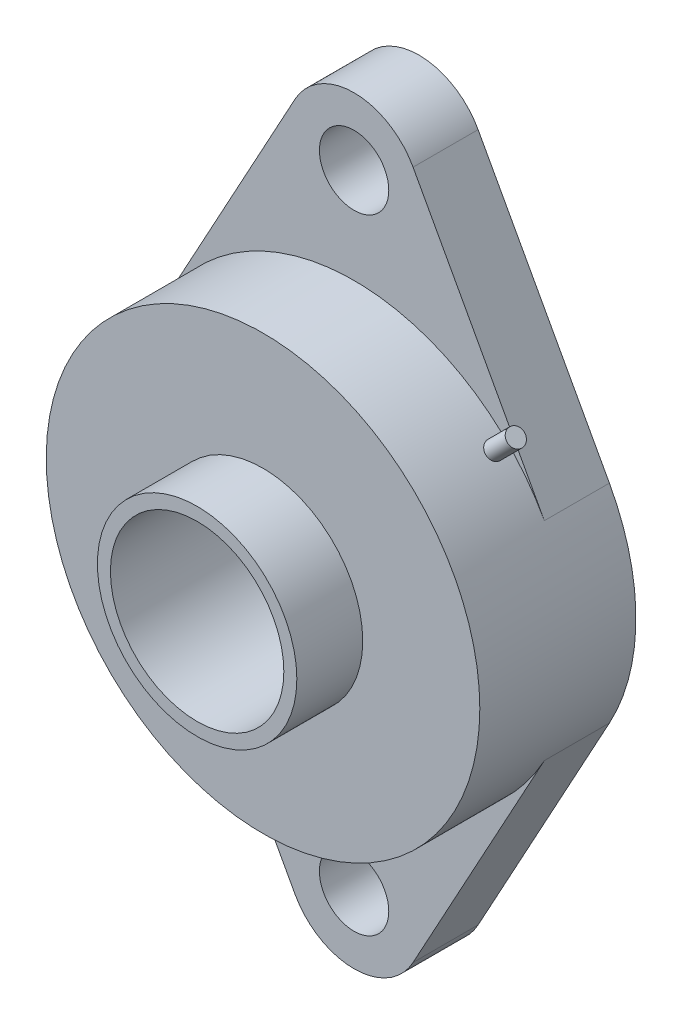
ISO-10303-21;
HEADER;
FILE_DESCRIPTION(('STEP AP214'),'2;1');
FILE_NAME('part.step','',(''),(''),'','','');
FILE_SCHEMA(('AUTOMOTIVE_DESIGN { 1 0 10303 214 1 1 1 1 }'));
ENDSEC;
DATA;
#1=APPLICATION_CONTEXT('core data for automotive mechanical design processes');
#2=APPLICATION_PROTOCOL_DEFINITION('international standard','automotive_design',2000,#1);
#3=PRODUCT_CONTEXT('',#1,'mechanical');
#4=PRODUCT('Part','Part','',(#3));
#5=PRODUCT_RELATED_PRODUCT_CATEGORY('part','',(#4));
#6=PRODUCT_DEFINITION_FORMATION('','',#4);
#7=PRODUCT_DEFINITION_CONTEXT('part definition',#1,'design');
#8=PRODUCT_DEFINITION('design','',#6,#7);
#9=PRODUCT_DEFINITION_SHAPE('','',#8);
#10=(LENGTH_UNIT() NAMED_UNIT(*) SI_UNIT(.MILLI.,.METRE.));
#11=(NAMED_UNIT(*) PLANE_ANGLE_UNIT() SI_UNIT($,.RADIAN.));
#12=(NAMED_UNIT(*) SI_UNIT($,.STERADIAN.) SOLID_ANGLE_UNIT());
#13=UNCERTAINTY_MEASURE_WITH_UNIT(LENGTH_MEASURE(1.E-05),#10,'distance_accuracy_value','');
#14=(GEOMETRIC_REPRESENTATION_CONTEXT(3) GLOBAL_UNCERTAINTY_ASSIGNED_CONTEXT((#13)) GLOBAL_UNIT_ASSIGNED_CONTEXT((#10,
#11,#12)) REPRESENTATION_CONTEXT('',''));
#15=CARTESIAN_POINT('',(0.,0.,0.));
#16=DIRECTION('',(0.,0.,1.));
#17=DIRECTION('',(1.,0.,0.));
#18=AXIS2_PLACEMENT_3D('',#15,#16,#17);
#19=CARTESIAN_POINT('',(0.,0.,51.2));
#20=DIRECTION('',(0.,0.,-1.));
#21=DIRECTION('',(-1.,0.,0.));
#22=AXIS2_PLACEMENT_3D('',#19,#20,#21);
#23=CYLINDRICAL_SURFACE('',#22,20.);
#24=CARTESIAN_POINT('',(0.,0.,51.2));
#25=DIRECTION('',(0.,0.,1.));
#26=DIRECTION('',(1.,0.,0.));
#27=AXIS2_PLACEMENT_3D('',#24,#25,#26);
#28=CIRCLE('',#27,20.);
#29=CARTESIAN_POINT('',(20.,0.,51.2));
#30=VERTEX_POINT('',#29);
#31=EDGE_CURVE('E43',#30,#30,#28,.T.);
#32=ORIENTED_EDGE('',*,*,#31,.T.);
#33=EDGE_LOOP('',(#32));
#34=FACE_BOUND('',#33,.T.);
#35=CARTESIAN_POINT('',(0.,0.,2.));
#36=DIRECTION('',(0.,0.,-1.));
#37=DIRECTION('',(-1.,0.,0.));
#38=AXIS2_PLACEMENT_3D('',#35,#36,#37);
#39=CIRCLE('',#38,20.);
#40=CARTESIAN_POINT('',(-20.,0.,2.));
#41=VERTEX_POINT('',#40);
#42=EDGE_CURVE('E38',#41,#41,#39,.T.);
#43=ORIENTED_EDGE('',*,*,#42,.T.);
#44=EDGE_LOOP('',(#43));
#45=FACE_BOUND('',#44,.T.);
#46=ADVANCED_FACE('F34',(#34,#45),#23,.F.);
#47=CARTESIAN_POINT('',(0.,0.,0.));
#48=DIRECTION('',(0.,0.,1.));
#49=DIRECTION('',(1.,0.,0.));
#50=AXIS2_PLACEMENT_3D('',#47,#48,#49);
#51=PLANE('',#50);
#52=CARTESIAN_POINT('',(0.,0.,0.));
#53=DIRECTION('',(0.,0.,-1.));
#54=DIRECTION('',(-1.,0.,0.));
#55=AXIS2_PLACEMENT_3D('',#52,#53,#54);
#56=CIRCLE('',#55,30.);
#57=CARTESIAN_POINT('',(-30.,0.,0.));
#58=VERTEX_POINT('',#57);
#59=EDGE_CURVE('E417',#58,#58,#56,.T.);
#60=ORIENTED_EDGE('',*,*,#59,.F.);
#61=EDGE_LOOP('',(#60));
#62=FACE_BOUND('',#61,.T.);
#63=CARTESIAN_POINT('',(0.,72.,0.));
#64=DIRECTION('',(0.,0.,1.));
#65=DIRECTION('',(1.,0.,0.));
#66=AXIS2_PLACEMENT_3D('',#63,#64,#65);
#67=CIRCLE('',#66,8.);
#68=CARTESIAN_POINT('',(8.00000000000002,72.,0.));
#69=VERTEX_POINT('',#68);
#70=EDGE_CURVE('E427',#69,#69,#67,.T.);
#71=ORIENTED_EDGE('',*,*,#70,.T.);
#72=EDGE_LOOP('',(#71));
#73=FACE_BOUND('',#72,.T.);
#74=CARTESIAN_POINT('',(0.,0.,0.));
#75=DIRECTION('',(0.,0.,1.));
#76=DIRECTION('',(1.,0.,0.));
#77=AXIS2_PLACEMENT_3D('',#74,#75,#76);
#78=CIRCLE('',#77,50.);
#79=CARTESIAN_POINT('',(43.8861967352936,-23.9583333333334,0.));
#80=VERTEX_POINT('',#79);
#81=CARTESIAN_POINT('',(43.8861967352936,23.9583333333334,0.));
#82=VERTEX_POINT('',#81);
#83=EDGE_CURVE('E164',#80,#82,#78,.T.);
#84=ORIENTED_EDGE('',*,*,#83,.F.);
#85=DIRECTION('',(0.479166666666667,0.87772393470587,0.));
#86=VECTOR('',#85,1.);
#87=CARTESIAN_POINT('',(13.604720987941,-79.4270833333333,0.));
#88=LINE('',#87,#86);
#89=CARTESIAN_POINT('',(13.604720987941,-79.4270833333333,0.));
#90=VERTEX_POINT('',#89);
#91=EDGE_CURVE('E135',#90,#80,#88,.T.);
#92=ORIENTED_EDGE('',*,*,#91,.F.);
#93=CARTESIAN_POINT('',(0.,-72.,0.));
#94=DIRECTION('',(0.,0.,1.));
#95=DIRECTION('',(1.,0.,0.));
#96=AXIS2_PLACEMENT_3D('',#93,#94,#95);
#97=CIRCLE('',#96,15.5);
#98=CARTESIAN_POINT('',(-13.604720987941,-79.4270833333333,0.));
#99=VERTEX_POINT('',#98);
#100=EDGE_CURVE('E126',#99,#90,#97,.T.);
#101=ORIENTED_EDGE('',*,*,#100,.F.);
#102=DIRECTION('',(0.479166666666667,-0.877723934705871,0.));
#103=VECTOR('',#102,1.);
#104=CARTESIAN_POINT('',(-43.8861967352936,-23.9583333333334,0.));
#105=LINE('',#104,#103);
#106=CARTESIAN_POINT('',(-43.8861967352935,-23.9583333333333,0.));
#107=VERTEX_POINT('',#106);
#108=EDGE_CURVE('E124',#107,#99,#105,.T.);
#109=ORIENTED_EDGE('',*,*,#108,.F.);
#110=CARTESIAN_POINT('',(-43.8861967352936,23.9583333333333,0.));
#111=VERTEX_POINT('',#110);
#112=EDGE_CURVE('E160',#111,#107,#78,.T.);
#113=ORIENTED_EDGE('',*,*,#112,.F.);
#114=DIRECTION('',(-0.479166666666667,-0.877723934705871,0.));
#115=VECTOR('',#114,1.);
#116=CARTESIAN_POINT('',(-13.604720987941,79.4270833333333,0.));
#117=LINE('',#116,#115);
#118=CARTESIAN_POINT('',(-13.604720987941,79.4270833333333,0.));
#119=VERTEX_POINT('',#118);
#120=EDGE_CURVE('E439',#119,#111,#117,.T.);
#121=ORIENTED_EDGE('',*,*,#120,.F.);
#122=CARTESIAN_POINT('',(0.,72.,0.));
#123=DIRECTION('',(0.,0.,1.));
#124=DIRECTION('',(1.,0.,0.));
#125=AXIS2_PLACEMENT_3D('',#122,#123,#124);
#126=CIRCLE('',#125,15.5);
#127=CARTESIAN_POINT('',(13.604720987941,79.4270833333333,0.));
#128=VERTEX_POINT('',#127);
#129=EDGE_CURVE('E123',#128,#119,#126,.T.);
#130=ORIENTED_EDGE('',*,*,#129,.F.);
#131=DIRECTION('',(-0.479166666666667,0.87772393470587,0.));
#132=VECTOR('',#131,1.);
#133=CARTESIAN_POINT('',(13.604720987941,79.4270833333333,0.));
#134=LINE('',#133,#132);
#135=EDGE_CURVE('E119',#82,#128,#134,.T.);
#136=ORIENTED_EDGE('',*,*,#135,.F.);
#137=EDGE_LOOP('',(#84,#92,#101,#109,#113,#121,#130,#136));
#138=FACE_BOUND('',#137,.T.);
#139=CARTESIAN_POINT('',(0.,-72.,0.));
#140=DIRECTION('',(0.,0.,1.));
#141=DIRECTION('',(1.,0.,0.));
#142=AXIS2_PLACEMENT_3D('',#139,#140,#141);
#143=CIRCLE('',#142,8.);
#144=CARTESIAN_POINT('',(8.00000000000002,-72.,0.));
#145=VERTEX_POINT('',#144);
#146=EDGE_CURVE('E174',#145,#145,#143,.T.);
#147=ORIENTED_EDGE('',*,*,#146,.T.);
#148=EDGE_LOOP('',(#147));
#149=FACE_BOUND('',#148,.T.);
#150=ADVANCED_FACE('F210',(#62,#73,#138,#149),#51,.F.);
#151=CARTESIAN_POINT('',(0.,0.,15.));
#152=DIRECTION('',(0.,0.,1.));
#153=DIRECTION('',(1.,0.,0.));
#154=AXIS2_PLACEMENT_3D('',#151,#152,#153);
#155=PLANE('',#154);
#156=CARTESIAN_POINT('',(0.,0.,15.));
#157=DIRECTION('',(0.,0.,-1.));
#158=DIRECTION('',(1.,0.,0.));
#159=AXIS2_PLACEMENT_3D('',#156,#157,#158);
#160=CIRCLE('',#159,50.);
#161=CARTESIAN_POINT('',(43.8861967352935,-23.9583333333333,15.));
#162=VERTEX_POINT('',#161);
#163=CARTESIAN_POINT('',(-43.8861967352935,-23.9583333333333,15.));
#164=VERTEX_POINT('',#163);
#165=EDGE_CURVE('E131',#162,#164,#160,.T.);
#166=ORIENTED_EDGE('',*,*,#165,.T.);
#167=DIRECTION('',(0.479166666666667,-0.877723934705871,0.));
#168=VECTOR('',#167,1.);
#169=CARTESIAN_POINT('',(-43.8861967352936,-23.9583333333334,15.));
#170=LINE('',#169,#168);
#171=CARTESIAN_POINT('',(-13.604720987941,-79.4270833333333,15.));
#172=VERTEX_POINT('',#171);
#173=EDGE_CURVE('E134',#164,#172,#170,.T.);
#174=ORIENTED_EDGE('',*,*,#173,.T.);
#175=CARTESIAN_POINT('',(0.,-72.,15.));
#176=DIRECTION('',(0.,0.,1.));
#177=DIRECTION('',(1.,0.,0.));
#178=AXIS2_PLACEMENT_3D('',#175,#176,#177);
#179=CIRCLE('',#178,15.5);
#180=CARTESIAN_POINT('',(13.604720987941,-79.4270833333333,15.));
#181=VERTEX_POINT('',#180);
#182=EDGE_CURVE('E137',#172,#181,#179,.T.);
#183=ORIENTED_EDGE('',*,*,#182,.T.);
#184=DIRECTION('',(0.479166666666667,0.87772393470587,0.));
#185=VECTOR('',#184,1.);
#186=CARTESIAN_POINT('',(13.604720987941,-79.4270833333333,15.));
#187=LINE('',#186,#185);
#188=EDGE_CURVE('E139',#181,#162,#187,.T.);
#189=ORIENTED_EDGE('',*,*,#188,.T.);
#190=EDGE_LOOP('',(#166,#174,#183,#189));
#191=FACE_BOUND('',#190,.T.);
#192=CARTESIAN_POINT('',(0.,-72.,15.));
#193=DIRECTION('',(0.,0.,1.));
#194=DIRECTION('',(1.,0.,0.));
#195=AXIS2_PLACEMENT_3D('',#192,#193,#194);
#196=CIRCLE('',#195,8.);
#197=CARTESIAN_POINT('',(8.00000000000002,-72.,15.));
#198=VERTEX_POINT('',#197);
#199=EDGE_CURVE('E424',#198,#198,#196,.T.);
#200=ORIENTED_EDGE('',*,*,#199,.F.);
#201=EDGE_LOOP('',(#200));
#202=FACE_BOUND('',#201,.T.);
#203=ADVANCED_FACE('F199',(#191,#202),#155,.T.);
#204=CARTESIAN_POINT('',(0.,72.,15.));
#205=DIRECTION('',(0.,0.,1.));
#206=DIRECTION('',(1.,0.,0.));
#207=AXIS2_PLACEMENT_3D('',#204,#205,#206);
#208=PLANE('',#207);
#209=CARTESIAN_POINT('',(0.,72.,15.));
#210=DIRECTION('',(0.,0.,1.));
#211=DIRECTION('',(1.,0.,0.));
#212=AXIS2_PLACEMENT_3D('',#209,#210,#211);
#213=CIRCLE('',#212,15.5);
#214=CARTESIAN_POINT('',(13.604720987941,79.4270833333333,15.));
#215=VERTEX_POINT('',#214);
#216=CARTESIAN_POINT('',(-13.604720987941,79.4270833333333,15.));
#217=VERTEX_POINT('',#216);
#218=EDGE_CURVE('E109',#215,#217,#213,.T.);
#219=ORIENTED_EDGE('',*,*,#218,.T.);
#220=DIRECTION('',(-0.479166666666667,-0.877723934705871,0.));
#221=VECTOR('',#220,1.);
#222=CARTESIAN_POINT('',(-13.604720987941,79.4270833333333,15.));
#223=LINE('',#222,#221);
#224=CARTESIAN_POINT('',(-43.8861967352936,23.9583333333334,15.));
#225=VERTEX_POINT('',#224);
#226=EDGE_CURVE('E100',#217,#225,#223,.T.);
#227=ORIENTED_EDGE('',*,*,#226,.T.);
#228=CARTESIAN_POINT('',(0.,0.,15.));
#229=DIRECTION('',(0.,0.,-1.));
#230=DIRECTION('',(1.,0.,0.));
#231=AXIS2_PLACEMENT_3D('',#228,#229,#230);
#232=CIRCLE('',#231,50.);
#233=CARTESIAN_POINT('',(43.8861967352935,23.9583333333333,15.));
#234=VERTEX_POINT('',#233);
#235=EDGE_CURVE('E51',#225,#234,#232,.T.);
#236=ORIENTED_EDGE('',*,*,#235,.T.);
#237=DIRECTION('',(-0.479166666666667,0.87772393470587,0.));
#238=VECTOR('',#237,1.);
#239=CARTESIAN_POINT('',(13.604720987941,79.4270833333333,15.));
#240=LINE('',#239,#238);
#241=EDGE_CURVE('E115',#234,#215,#240,.T.);
#242=ORIENTED_EDGE('',*,*,#241,.T.);
#243=EDGE_LOOP('',(#219,#227,#236,#242));
#244=FACE_BOUND('',#243,.T.);
#245=CARTESIAN_POINT('',(0.,72.,15.));
#246=DIRECTION('',(0.,0.,1.));
#247=DIRECTION('',(1.,0.,0.));
#248=AXIS2_PLACEMENT_3D('',#245,#246,#247);
#249=CIRCLE('',#248,8.);
#250=CARTESIAN_POINT('',(8.00000000000002,72.,15.));
#251=VERTEX_POINT('',#250);
#252=EDGE_CURVE('E430',#251,#251,#249,.T.);
#253=ORIENTED_EDGE('',*,*,#252,.F.);
#254=EDGE_LOOP('',(#253));
#255=FACE_BOUND('',#254,.T.);
#256=ADVANCED_FACE('F112',(#244,#255),#208,.T.);
#257=CARTESIAN_POINT('',(0.,0.,36.));
#258=DIRECTION('',(0.,0.,-1.));
#259=DIRECTION('',(-1.,0.,0.));
#260=AXIS2_PLACEMENT_3D('',#257,#258,#259);
#261=CYLINDRICAL_SURFACE('',#260,50.);
#262=CARTESIAN_POINT('',(36.7412570276842,33.9128299029385,18.));
#263=CARTESIAN_POINT('',(36.7412538980985,33.9128337946474,18.1122926534912));
#264=CARTESIAN_POINT('',(36.7348178850891,33.9198102085924,18.2246655859337));
#265=CARTESIAN_POINT('',(36.7092116768779,33.9475200894859,18.4463133332678));
#266=CARTESIAN_POINT('',(36.6900263611424,33.9682698914891,18.5555843086261));
#267=CARTESIAN_POINT('',(36.6394042344887,34.0228663582317,18.7677851586489));
#268=CARTESIAN_POINT('',(36.6079735273043,34.0567064980128,18.8707181629295));
#269=CARTESIAN_POINT('',(36.533660342832,34.1364118851168,19.0673471706232));
#270=CARTESIAN_POINT('',(36.4907806205857,34.1822742394173,19.1610453888386));
#271=CARTESIAN_POINT('',(36.3946268576771,34.2846329253696,19.3366390375184));
#272=CARTESIAN_POINT('',(36.3413465488135,34.341135669018,19.4185272983768));
#273=CARTESIAN_POINT('',(36.2257796203054,34.4630226323976,19.5681157022766));
#274=CARTESIAN_POINT('',(36.1634926382728,34.5284072094875,19.6358152741604));
#275=CARTESIAN_POINT('',(36.0315266679976,34.6660953709876,19.7551211289999));
#276=CARTESIAN_POINT('',(35.9618453437852,34.7384011411828,19.8067223058558));
#277=CARTESIAN_POINT('',(35.8169733592581,34.8877518876771,19.8923336882589));
#278=CARTESIAN_POINT('',(35.741782729604,34.9647968376014,19.9263439916947));
#279=CARTESIAN_POINT('',(35.587991442055,35.1213167415569,19.9757905740307));
#280=CARTESIAN_POINT('',(35.5093926477957,35.2007903607075,19.9912368745513));
#281=CARTESIAN_POINT('',(35.3509438527091,35.3599119532243,20.0031478937352));
#282=CARTESIAN_POINT('',(35.2710938590013,35.4395599255961,19.9996127203656));
#283=CARTESIAN_POINT('',(35.1124660403207,35.5967300669026,19.9736695143563));
#284=CARTESIAN_POINT('',(35.033687628118,35.674253425893,19.9512722795936));
#285=CARTESIAN_POINT('',(34.8794437929742,35.8250756261944,19.888257449125));
#286=CARTESIAN_POINT('',(34.8039783802225,35.8983744545127,19.8476397973848));
#287=CARTESIAN_POINT('',(34.6585689238183,36.0387823008228,19.7493247608042));
#288=CARTESIAN_POINT('',(34.5886264832882,36.1058895225564,19.6916224398072));
#289=CARTESIAN_POINT('',(34.4563864533039,36.2321100944659,19.5607796511493));
#290=CARTESIAN_POINT('',(34.3940888973058,36.2912234096583,19.4876391159301));
#291=CARTESIAN_POINT('',(34.2789953800471,36.3999555315313,19.3279350071071));
#292=CARTESIAN_POINT('',(34.2262061054676,36.4495676580573,19.2413620662152));
#293=CARTESIAN_POINT('',(34.1318142334225,36.5379727537184,19.0572836105646));
#294=CARTESIAN_POINT('',(34.0902116382215,36.5767657206633,18.9597780935929));
#295=CARTESIAN_POINT('',(34.0194933480095,36.6425492630829,18.7565968178562));
#296=CARTESIAN_POINT('',(33.9903778914354,36.6695396131917,18.6509209031261));
#297=CARTESIAN_POINT('',(33.9455546498864,36.7110373112181,18.4344010633248));
#298=CARTESIAN_POINT('',(33.9298468002881,36.7255447193022,18.3235571631656));
#299=CARTESIAN_POINT('',(33.9123439424199,36.7417075447215,18.0999300818961));
#300=CARTESIAN_POINT('',(33.9105392999047,36.7433718616945,17.9871482979689));
#301=CARTESIAN_POINT('',(33.9208748807671,36.7338303868262,17.7627746209684));
#302=CARTESIAN_POINT('',(33.9330150748967,36.7226246219788,17.6511827253999));
#303=CARTESIAN_POINT('',(33.970848296526,36.6876290163225,17.4323931829961));
#304=CARTESIAN_POINT('',(33.996536942789,36.6638432435725,17.3251941276941));
#305=CARTESIAN_POINT('',(34.0606532119424,36.6042867193175,17.1181899409087));
#306=CARTESIAN_POINT('',(34.0990808815704,36.5685159238414,17.0183848365543));
#307=CARTESIAN_POINT('',(34.1874970821075,36.4858697761036,16.8289413147551));
#308=CARTESIAN_POINT('',(34.2374919727528,36.4389883147766,16.7393085306767));
#309=CARTESIAN_POINT('',(34.3474825818803,36.33532903242,16.5728106157135));
#310=CARTESIAN_POINT('',(34.4074783426594,36.2785511695351,16.4959455388304));
#311=CARTESIAN_POINT('',(34.5356727547627,36.1565364382233,16.3571210796337));
#312=CARTESIAN_POINT('',(34.6038760271277,36.0912948028459,16.2951701538212));
#313=CARTESIAN_POINT('',(34.7463996740746,35.9541024142673,16.1879903549255));
#314=CARTESIAN_POINT('',(34.8207200292299,35.8821516823727,16.1427614287392));
#315=CARTESIAN_POINT('',(34.9732454844669,35.7335056690725,16.0703243359859));
#316=CARTESIAN_POINT('',(35.0514494024491,35.6568118296763,16.0431107215297));
#317=CARTESIAN_POINT('',(35.2094773810138,35.5007750288549,16.0074588948719));
#318=CARTESIAN_POINT('',(35.2893014368001,35.4214320752717,15.9990206270966));
#319=CARTESIAN_POINT('',(35.4482239788052,35.262388549268,16.0011596389937));
#320=CARTESIAN_POINT('',(35.5273229332921,35.1826882656643,16.0117236279177));
#321=CARTESIAN_POINT('',(35.6826317061643,35.0251628640144,16.0515398711409));
#322=CARTESIAN_POINT('',(35.7588415189335,34.9473377496133,16.0807921617653));
#323=CARTESIAN_POINT('',(35.906279256313,34.7958372875873,16.1571522445456));
#324=CARTESIAN_POINT('',(35.9775071134573,34.7221619961621,16.2042602784496));
#325=CARTESIAN_POINT('',(36.1130632741201,34.5811543833564,16.3149915911482));
#326=CARTESIAN_POINT('',(36.1773918105041,34.5138218479047,16.3786143122921));
#327=CARTESIAN_POINT('',(36.2974944057516,34.3874906792233,16.5206139209755));
#328=CARTESIAN_POINT('',(36.3532633783472,34.3284970027468,16.5989995197866));
#329=CARTESIAN_POINT('',(36.4547701949925,34.2206842264469,16.7683044561447));
#330=CARTESIAN_POINT('',(36.5005055588133,34.1718676424683,16.8592268836717));
#331=CARTESIAN_POINT('',(36.5807903373846,34.0859098642215,17.0510757244687));
#332=CARTESIAN_POINT('',(36.6153309595563,34.0487778479139,17.15200992032));
#333=CARTESIAN_POINT('',(36.6722727120233,33.9874415366271,17.3608849773614));
#334=CARTESIAN_POINT('',(36.694688258652,33.9632218897425,17.468817346116));
#335=CARTESIAN_POINT('',(36.7209079856582,33.9348658912055,17.6478555544495));
#336=CARTESIAN_POINT('',(36.7285301960381,33.9266138424838,17.7178003240909));
#337=CARTESIAN_POINT('',(36.7387057019125,33.9155946234346,17.8584860999676));
#338=CARTESIAN_POINT('',(36.7412590001182,33.9128274501735,17.929227105777));
#339=CARTESIAN_POINT('',(36.7412570276842,33.9128299029385,18.));
#340=B_SPLINE_CURVE_WITH_KNOTS('',3,(#262,#263,#264,#265,#266,#267,#268,#269,#270,#271,#272,
#273,#274,#275,#276,#277,#278,#279,#280,#281,#282,#283,#284,#285,#286,#287,#288,#289,#290,#291,
#292,#293,#294,#295,#296,#297,#298,#299,#300,#301,#302,#303,#304,#305,#306,#307,#308,#309,#310,
#311,#312,#313,#314,#315,#316,#317,#318,#319,#320,#321,#322,#323,#324,#325,#326,#327,#328,#329,
#330,#331,#332,#333,#334,#335,#336,#337,#338,#339),.UNSPECIFIED.,.T.,.F.,(4,2,2,2,2,2,2,2,2,2,2,
2,2,2,2,2,2,2,2,2,2,2,2,2,2,2,2,2,2,2,2,2,2,2,2,2,2,2,4),(0.,0.336619622390038,
0.673639186175591,1.01049097653095,1.34726178126044,1.68423618037817,2.02122414160336,
2.35831888048491,2.69541174350356,3.03232254792667,3.36923143599827,3.70594758639948,
4.04266477233162,4.37947933874713,4.71629537910785,5.05334736769912,5.3903994245195,
5.72745791692787,6.06451478474076,6.40133806753782,6.73816064388327,7.07487436680133,
7.41158932508703,7.74848985331646,8.08539180644552,8.42248433942655,8.75957580191514,
9.09656528022188,9.43355376106157,9.77030663368974,10.1070601608797,10.443818247522,
10.7805649643459,11.1175110146366,11.4545402617155,11.7918335805485,12.1287249817978,
12.3408809593285,12.5530368233864),.UNSPECIFIED.);
#341=CARTESIAN_POINT('',(36.7412570276842,33.9128299029385,18.));
#342=VERTEX_POINT('',#341);
#343=EDGE_CURVE('E167',#342,#342,#340,.T.);
#344=ORIENTED_EDGE('',*,*,#343,.T.);
#345=EDGE_LOOP('',(#344));
#346=FACE_BOUND('',#345,.T.);
#347=ORIENTED_EDGE('',*,*,#235,.F.);
#348=DIRECTION('',(0.,0.,-1.));
#349=VECTOR('',#348,1.);
#350=CARTESIAN_POINT('',(-43.8861967352936,23.9583333333333,15.));
#351=LINE('',#350,#349);
#352=EDGE_CURVE('E107',#225,#111,#351,.T.);
#353=ORIENTED_EDGE('',*,*,#352,.T.);
#354=ORIENTED_EDGE('',*,*,#112,.T.);
#355=DIRECTION('',(0.,0.,-1.));
#356=VECTOR('',#355,1.);
#357=CARTESIAN_POINT('',(-43.8861967352936,-23.9583333333334,15.));
#358=LINE('',#357,#356);
#359=EDGE_CURVE('E154',#164,#107,#358,.T.);
#360=ORIENTED_EDGE('',*,*,#359,.F.);
#361=ORIENTED_EDGE('',*,*,#165,.F.);
#362=DIRECTION('',(0.,0.,-1.));
#363=VECTOR('',#362,1.);
#364=CARTESIAN_POINT('',(43.8861967352936,-23.9583333333334,15.));
#365=LINE('',#364,#363);
#366=EDGE_CURVE('E141',#162,#80,#365,.T.);
#367=ORIENTED_EDGE('',*,*,#366,.T.);
#368=ORIENTED_EDGE('',*,*,#83,.T.);
#369=DIRECTION('',(0.,0.,-1.));
#370=VECTOR('',#369,1.);
#371=CARTESIAN_POINT('',(43.8861967352936,23.9583333333334,15.));
#372=LINE('',#371,#370);
#373=EDGE_CURVE('E56',#234,#82,#372,.T.);
#374=ORIENTED_EDGE('',*,*,#373,.F.);
#375=EDGE_LOOP('',(#347,#353,#354,#360,#361,#367,#368,#374));
#376=FACE_BOUND('',#375,.T.);
#377=CARTESIAN_POINT('',(0.,0.,36.));
#378=DIRECTION('',(0.,0.,1.));
#379=DIRECTION('',(1.,0.,0.));
#380=AXIS2_PLACEMENT_3D('',#377,#378,#379);
#381=CIRCLE('',#380,50.);
#382=CARTESIAN_POINT('',(50.,0.,36.));
#383=VERTEX_POINT('',#382);
#384=EDGE_CURVE('E161',#383,#383,#381,.T.);
#385=ORIENTED_EDGE('',*,*,#384,.F.);
#386=EDGE_LOOP('',(#385));
#387=FACE_BOUND('',#386,.T.);
#388=ADVANCED_FACE('F176',(#346,#376,#387),#261,.T.);
#389=CARTESIAN_POINT('',(0.,0.,51.2));
#390=DIRECTION('',(0.,0.,1.));
#391=DIRECTION('',(1.,0.,0.));
#392=AXIS2_PLACEMENT_3D('',#389,#390,#391);
#393=PLANE('',#392);
#394=CARTESIAN_POINT('',(0.,0.,51.2));
#395=DIRECTION('',(0.,0.,1.));
#396=DIRECTION('',(1.,0.,0.));
#397=AXIS2_PLACEMENT_3D('',#394,#395,#396);
#398=CIRCLE('',#397,23.);
#399=CARTESIAN_POINT('',(23.,0.,51.2));
#400=VERTEX_POINT('',#399);
#401=EDGE_CURVE('E11',#400,#400,#398,.T.);
#402=ORIENTED_EDGE('',*,*,#401,.T.);
#403=EDGE_LOOP('',(#402));
#404=FACE_BOUND('',#403,.T.);
#405=ORIENTED_EDGE('',*,*,#31,.F.);
#406=EDGE_LOOP('',(#405));
#407=FACE_BOUND('',#406,.T.);
#408=ADVANCED_FACE('F228',(#404,#407),#393,.T.);
#409=CARTESIAN_POINT('',(0.,0.,51.2));
#410=DIRECTION('',(0.,0.,-1.));
#411=DIRECTION('',(-1.,0.,0.));
#412=AXIS2_PLACEMENT_3D('',#409,#410,#411);
#413=CYLINDRICAL_SURFACE('',#412,23.);
#414=CARTESIAN_POINT('',(0.,0.,36.));
#415=DIRECTION('',(0.,0.,1.));
#416=DIRECTION('',(1.,0.,0.));
#417=AXIS2_PLACEMENT_3D('',#414,#415,#416);
#418=CIRCLE('',#417,23.);
#419=CARTESIAN_POINT('',(23.,0.,36.));
#420=VERTEX_POINT('',#419);
#421=EDGE_CURVE('E157',#420,#420,#418,.T.);
#422=ORIENTED_EDGE('',*,*,#421,.T.);
#423=EDGE_LOOP('',(#422));
#424=FACE_BOUND('',#423,.T.);
#425=ORIENTED_EDGE('',*,*,#401,.F.);
#426=EDGE_LOOP('',(#425));
#427=FACE_BOUND('',#426,.T.);
#428=ADVANCED_FACE('F36',(#424,#427),#413,.T.);
#429=CARTESIAN_POINT('',(0.,0.,36.));
#430=DIRECTION('',(0.,0.,1.));
#431=DIRECTION('',(1.,0.,0.));
#432=AXIS2_PLACEMENT_3D('',#429,#430,#431);
#433=PLANE('',#432);
#434=ORIENTED_EDGE('',*,*,#384,.T.);
#435=EDGE_LOOP('',(#434));
#436=FACE_BOUND('',#435,.T.);
#437=ORIENTED_EDGE('',*,*,#421,.F.);
#438=EDGE_LOOP('',(#437));
#439=FACE_BOUND('',#438,.T.);
#440=ADVANCED_FACE('F221',(#436,#439),#433,.T.);
#441=CARTESIAN_POINT('',(-43.8861967352936,-23.9583333333334,15.));
#442=DIRECTION('',(0.877723934705871,0.479166666666667,0.));
#443=DIRECTION('',(-0.479166666666667,0.877723934705871,0.));
#444=AXIS2_PLACEMENT_3D('',#441,#442,#443);
#445=PLANE('',#444);
#446=ORIENTED_EDGE('',*,*,#108,.T.);
#447=DIRECTION('',(0.,0.,-1.));
#448=VECTOR('',#447,1.);
#449=CARTESIAN_POINT('',(-13.604720987941,-79.4270833333333,15.));
#450=LINE('',#449,#448);
#451=EDGE_CURVE('E151',#172,#99,#450,.T.);
#452=ORIENTED_EDGE('',*,*,#451,.F.);
#453=ORIENTED_EDGE('',*,*,#173,.F.);
#454=ORIENTED_EDGE('',*,*,#359,.T.);
#455=EDGE_LOOP('',(#446,#452,#453,#454));
#456=FACE_BOUND('',#455,.T.);
#457=ADVANCED_FACE('F218',(#456),#445,.F.);
#458=CARTESIAN_POINT('',(0.,-72.,15.));
#459=DIRECTION('',(0.,0.,-1.));
#460=DIRECTION('',(-1.,0.,0.));
#461=AXIS2_PLACEMENT_3D('',#458,#459,#460);
#462=CYLINDRICAL_SURFACE('',#461,15.5);
#463=ORIENTED_EDGE('',*,*,#100,.T.);
#464=DIRECTION('',(0.,0.,-1.));
#465=VECTOR('',#464,1.);
#466=CARTESIAN_POINT('',(13.604720987941,-79.4270833333333,15.));
#467=LINE('',#466,#465);
#468=EDGE_CURVE('E148',#181,#90,#467,.T.);
#469=ORIENTED_EDGE('',*,*,#468,.F.);
#470=ORIENTED_EDGE('',*,*,#182,.F.);
#471=ORIENTED_EDGE('',*,*,#451,.T.);
#472=EDGE_LOOP('',(#463,#469,#470,#471));
#473=FACE_BOUND('',#472,.T.);
#474=ADVANCED_FACE('F214',(#473),#462,.T.);
#475=CARTESIAN_POINT('',(13.604720987941,-79.4270833333333,15.));
#476=DIRECTION('',(-0.87772393470587,0.479166666666667,0.));
#477=DIRECTION('',(-0.479166666666667,-0.877723934705871,0.));
#478=AXIS2_PLACEMENT_3D('',#475,#476,#477);
#479=PLANE('',#478);
#480=ORIENTED_EDGE('',*,*,#91,.T.);
#481=ORIENTED_EDGE('',*,*,#366,.F.);
#482=ORIENTED_EDGE('',*,*,#188,.F.);
#483=ORIENTED_EDGE('',*,*,#468,.T.);
#484=EDGE_LOOP('',(#480,#481,#482,#483));
#485=FACE_BOUND('',#484,.T.);
#486=ADVANCED_FACE('F207',(#485),#479,.F.);
#487=CARTESIAN_POINT('',(0.,72.,15.));
#488=DIRECTION('',(0.,0.,-1.));
#489=DIRECTION('',(-1.,0.,0.));
#490=AXIS2_PLACEMENT_3D('',#487,#488,#489);
#491=CYLINDRICAL_SURFACE('',#490,15.5);
#492=ORIENTED_EDGE('',*,*,#129,.T.);
#493=DIRECTION('',(0.,0.,-1.));
#494=VECTOR('',#493,1.);
#495=CARTESIAN_POINT('',(-13.604720987941,79.4270833333333,15.));
#496=LINE('',#495,#494);
#497=EDGE_CURVE('E105',#217,#119,#496,.T.);
#498=ORIENTED_EDGE('',*,*,#497,.F.);
#499=ORIENTED_EDGE('',*,*,#218,.F.);
#500=DIRECTION('',(0.,0.,-1.));
#501=VECTOR('',#500,1.);
#502=CARTESIAN_POINT('',(13.604720987941,79.4270833333333,15.));
#503=LINE('',#502,#501);
#504=EDGE_CURVE('E437',#215,#128,#503,.T.);
#505=ORIENTED_EDGE('',*,*,#504,.T.);
#506=EDGE_LOOP('',(#492,#498,#499,#505));
#507=FACE_BOUND('',#506,.T.);
#508=ADVANCED_FACE('F121',(#507),#491,.T.);
#509=CARTESIAN_POINT('',(-13.604720987941,79.4270833333333,15.));
#510=DIRECTION('',(0.877723934705871,-0.479166666666667,0.));
#511=DIRECTION('',(0.479166666666667,0.877723934705871,0.));
#512=AXIS2_PLACEMENT_3D('',#509,#510,#511);
#513=PLANE('',#512);
#514=ORIENTED_EDGE('',*,*,#120,.T.);
#515=ORIENTED_EDGE('',*,*,#352,.F.);
#516=ORIENTED_EDGE('',*,*,#226,.F.);
#517=ORIENTED_EDGE('',*,*,#497,.T.);
#518=EDGE_LOOP('',(#514,#515,#516,#517));
#519=FACE_BOUND('',#518,.T.);
#520=ADVANCED_FACE('F103',(#519),#513,.F.);
#521=CARTESIAN_POINT('',(13.604720987941,79.4270833333333,15.));
#522=DIRECTION('',(-0.87772393470587,-0.479166666666667,0.));
#523=DIRECTION('',(0.479166666666667,-0.877723934705871,0.));
#524=AXIS2_PLACEMENT_3D('',#521,#522,#523);
#525=PLANE('',#524);
#526=ORIENTED_EDGE('',*,*,#135,.T.);
#527=ORIENTED_EDGE('',*,*,#504,.F.);
#528=ORIENTED_EDGE('',*,*,#241,.F.);
#529=ORIENTED_EDGE('',*,*,#373,.T.);
#530=EDGE_LOOP('',(#526,#527,#528,#529));
#531=FACE_BOUND('',#530,.T.);
#532=ADVANCED_FACE('F195',(#531),#525,.F.);
#533=CARTESIAN_POINT('',(0.,72.,15.));
#534=DIRECTION('',(0.,0.,-1.));
#535=DIRECTION('',(-1.,0.,0.));
#536=AXIS2_PLACEMENT_3D('',#533,#534,#535);
#537=CYLINDRICAL_SURFACE('',#536,8.);
#538=ORIENTED_EDGE('',*,*,#252,.T.);
#539=EDGE_LOOP('',(#538));
#540=FACE_BOUND('',#539,.T.);
#541=ORIENTED_EDGE('',*,*,#70,.F.);
#542=EDGE_LOOP('',(#541));
#543=FACE_BOUND('',#542,.T.);
#544=ADVANCED_FACE('F191',(#540,#543),#537,.F.);
#545=CARTESIAN_POINT('',(0.,-72.,15.));
#546=DIRECTION('',(0.,0.,-1.));
#547=DIRECTION('',(-1.,0.,0.));
#548=AXIS2_PLACEMENT_3D('',#545,#546,#547);
#549=CYLINDRICAL_SURFACE('',#548,8.);
#550=ORIENTED_EDGE('',*,*,#199,.T.);
#551=EDGE_LOOP('',(#550));
#552=FACE_BOUND('',#551,.T.);
#553=ORIENTED_EDGE('',*,*,#146,.F.);
#554=EDGE_LOOP('',(#553));
#555=FACE_BOUND('',#554,.T.);
#556=ADVANCED_FACE('F186',(#552,#555),#549,.F.);
#557=CARTESIAN_POINT('',(-701.140256875193,-701.140256875196,18.));
#558=DIRECTION('',(-0.707106781186546,-0.707106781186549,0.));
#559=DIRECTION('',(0.707106781186549,-0.707106781186546,0.));
#560=AXIS2_PLACEMENT_3D('',#557,#558,#559);
#561=CYLINDRICAL_SURFACE('',#560,2.);
#562=CARTESIAN_POINT('',(40.305086527633,40.3050865276334,18.));
#563=DIRECTION('',(-0.707106781186546,-0.707106781186549,0.));
#564=DIRECTION('',(0.707106781186549,-0.707106781186546,0.));
#565=AXIS2_PLACEMENT_3D('',#562,#563,#564);
#566=CIRCLE('',#565,1.99999999999999);
#567=CARTESIAN_POINT('',(41.7193000900061,38.8908729652603,18.));
#568=VERTEX_POINT('',#567);
#569=EDGE_CURVE('E175',#568,#568,#566,.T.);
#570=ORIENTED_EDGE('',*,*,#569,.T.);
#571=EDGE_LOOP('',(#570));
#572=FACE_BOUND('',#571,.T.);
#573=ORIENTED_EDGE('',*,*,#343,.F.);
#574=EDGE_LOOP('',(#573));
#575=FACE_BOUND('',#574,.T.);
#576=ADVANCED_FACE('F180',(#572,#575),#561,.T.);
#577=CARTESIAN_POINT('',(40.3050865276331,40.3050865276333,18.));
#578=DIRECTION('',(0.707106781186546,0.707106781186549,0.));
#579=DIRECTION('',(-0.707106781186549,0.707106781186546,0.));
#580=AXIS2_PLACEMENT_3D('',#577,#578,#579);
#581=PLANE('',#580);
#582=ORIENTED_EDGE('',*,*,#569,.F.);
#583=EDGE_LOOP('',(#582));
#584=FACE_BOUND('',#583,.T.);
#585=ADVANCED_FACE('F185',(#584),#581,.T.);
#586=CARTESIAN_POINT('',(0.,0.,2.));
#587=DIRECTION('',(0.,0.,-1.));
#588=DIRECTION('',(-1.,0.,0.));
#589=AXIS2_PLACEMENT_3D('',#586,#587,#588);
#590=CYLINDRICAL_SURFACE('',#589,30.);
#591=CARTESIAN_POINT('',(0.,0.,2.));
#592=DIRECTION('',(0.,0.,-1.));
#593=DIRECTION('',(-1.,0.,0.));
#594=AXIS2_PLACEMENT_3D('',#591,#592,#593);
#595=CIRCLE('',#594,30.);
#596=CARTESIAN_POINT('',(-30.,0.,2.));
#597=VERTEX_POINT('',#596);
#598=EDGE_CURVE('E416',#597,#597,#595,.T.);
#599=ORIENTED_EDGE('',*,*,#598,.F.);
#600=EDGE_LOOP('',(#599));
#601=FACE_BOUND('',#600,.T.);
#602=ORIENTED_EDGE('',*,*,#59,.T.);
#603=EDGE_LOOP('',(#602));
#604=FACE_BOUND('',#603,.T.);
#605=ADVANCED_FACE('F285',(#601,#604),#590,.F.);
#606=CARTESIAN_POINT('',(0.,0.,2.));
#607=DIRECTION('',(0.,0.,-1.));
#608=DIRECTION('',(-1.,0.,0.));
#609=AXIS2_PLACEMENT_3D('',#606,#607,#608);
#610=PLANE('',#609);
#611=ORIENTED_EDGE('',*,*,#42,.F.);
#612=EDGE_LOOP('',(#611));
#613=FACE_BOUND('',#612,.T.);
#614=ORIENTED_EDGE('',*,*,#598,.T.);
#615=EDGE_LOOP('',(#614));
#616=FACE_BOUND('',#615,.T.);
#617=ADVANCED_FACE('F398',(#613,#616),#610,.T.);
#618=CLOSED_SHELL('',(#46,#150,#203,#256,#388,#408,#428,#440,#457,#474,#486,#508,#520,#532,#544,
#556,#576,#585,#605,#617));
#619=MANIFOLD_SOLID_BREP('B2',#618);
#620=ADVANCED_BREP_SHAPE_REPRESENTATION('',(#18,#619),#14);
#621=SHAPE_DEFINITION_REPRESENTATION(#9,#620);
ENDSEC;
END-ISO-10303-21;
